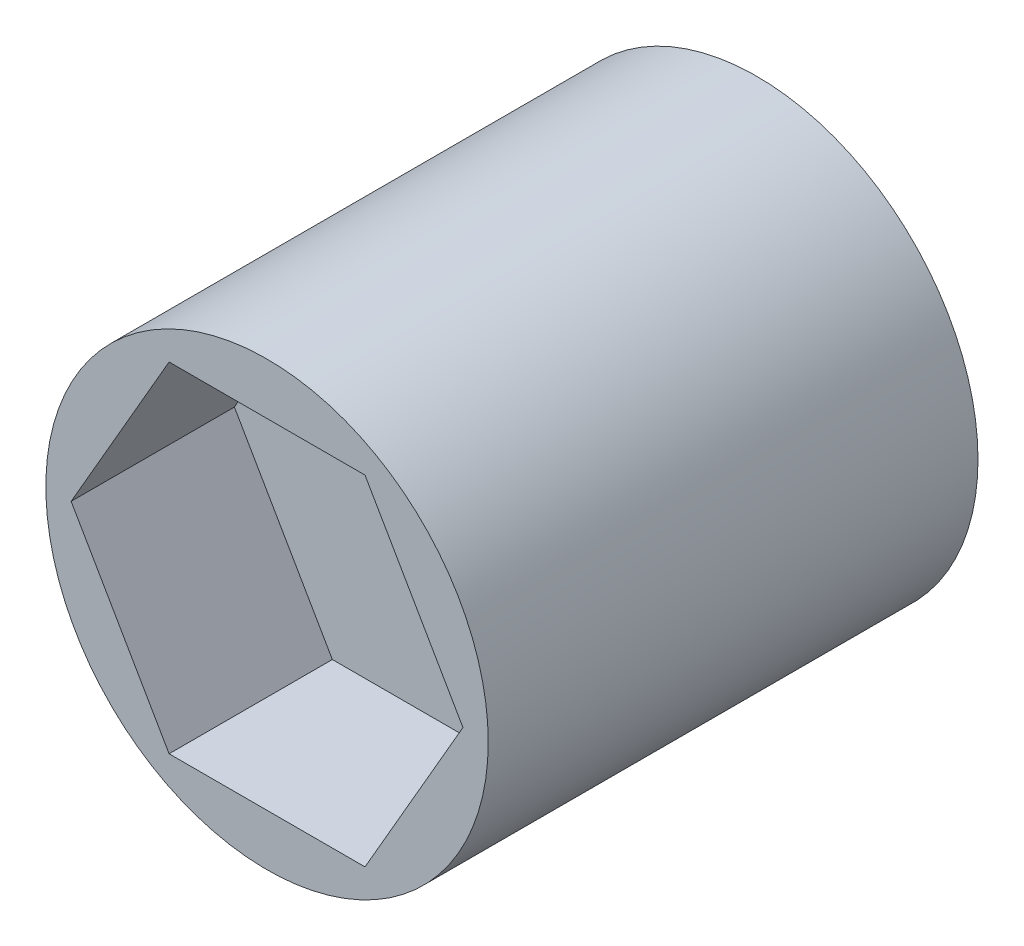
ISO-10303-21;
HEADER;
FILE_DESCRIPTION(('STEP AP214'),'2;1');
FILE_NAME('part.step','',(''),(''),'','','');
FILE_SCHEMA(('AUTOMOTIVE_DESIGN { 1 0 10303 214 1 1 1 1 }'));
ENDSEC;
DATA;
#1=APPLICATION_CONTEXT('core data for automotive mechanical design processes');
#2=APPLICATION_PROTOCOL_DEFINITION('international standard','automotive_design',2000,#1);
#3=PRODUCT_CONTEXT('',#1,'mechanical');
#4=PRODUCT('Part','Part','',(#3));
#5=PRODUCT_RELATED_PRODUCT_CATEGORY('part','',(#4));
#6=PRODUCT_DEFINITION_FORMATION('','',#4);
#7=PRODUCT_DEFINITION_CONTEXT('part definition',#1,'design');
#8=PRODUCT_DEFINITION('design','',#6,#7);
#9=PRODUCT_DEFINITION_SHAPE('','',#8);
#10=(LENGTH_UNIT() NAMED_UNIT(*) SI_UNIT(.MILLI.,.METRE.));
#11=(NAMED_UNIT(*) PLANE_ANGLE_UNIT() SI_UNIT($,.RADIAN.));
#12=(NAMED_UNIT(*) SI_UNIT($,.STERADIAN.) SOLID_ANGLE_UNIT());
#13=UNCERTAINTY_MEASURE_WITH_UNIT(LENGTH_MEASURE(1.E-05),#10,'distance_accuracy_value','');
#14=(GEOMETRIC_REPRESENTATION_CONTEXT(3) GLOBAL_UNCERTAINTY_ASSIGNED_CONTEXT((#13)) GLOBAL_UNIT_ASSIGNED_CONTEXT((#10,
#11,#12)) REPRESENTATION_CONTEXT('',''));
#15=CARTESIAN_POINT('',(0.,0.,0.));
#16=DIRECTION('',(0.,0.,1.));
#17=DIRECTION('',(1.,0.,0.));
#18=AXIS2_PLACEMENT_3D('',#15,#16,#17);
#19=CARTESIAN_POINT('',(0.,0.,15.));
#20=DIRECTION('',(0.,0.,-1.));
#21=DIRECTION('',(-1.,0.,0.));
#22=AXIS2_PLACEMENT_3D('',#19,#20,#21);
#23=CYLINDRICAL_SURFACE('',#22,6.775);
#24=CARTESIAN_POINT('',(0.,0.,15.));
#25=DIRECTION('',(0.,0.,1.));
#26=DIRECTION('',(1.,0.,0.));
#27=AXIS2_PLACEMENT_3D('',#24,#25,#26);
#28=CIRCLE('',#27,6.775);
#29=CARTESIAN_POINT('',(6.775,0.,15.));
#30=VERTEX_POINT('',#29);
#31=EDGE_CURVE('E11',#30,#30,#28,.T.);
#32=ORIENTED_EDGE('',*,*,#31,.F.);
#33=EDGE_LOOP('',(#32));
#34=FACE_BOUND('',#33,.T.);
#35=CARTESIAN_POINT('',(0.,0.,0.));
#36=DIRECTION('',(0.,0.,1.));
#37=DIRECTION('',(1.,0.,0.));
#38=AXIS2_PLACEMENT_3D('',#35,#36,#37);
#39=CIRCLE('',#38,6.775);
#40=CARTESIAN_POINT('',(6.775,0.,0.));
#41=VERTEX_POINT('',#40);
#42=EDGE_CURVE('E40',#41,#41,#39,.T.);
#43=ORIENTED_EDGE('',*,*,#42,.T.);
#44=EDGE_LOOP('',(#43));
#45=FACE_BOUND('',#44,.T.);
#46=ADVANCED_FACE('F37',(#34,#45),#23,.T.);
#47=CARTESIAN_POINT('',(0.,0.,15.));
#48=DIRECTION('',(0.,0.,1.));
#49=DIRECTION('',(1.,0.,0.));
#50=AXIS2_PLACEMENT_3D('',#47,#48,#49);
#51=PLANE('',#50);
#52=DIRECTION('',(0.5,-0.866025403784439,0.));
#53=VECTOR('',#52,1.);
#54=CARTESIAN_POINT('',(-6.,0.,15.));
#55=LINE('',#54,#53);
#56=CARTESIAN_POINT('',(-6.,0.,15.));
#57=VERTEX_POINT('',#56);
#58=CARTESIAN_POINT('',(-3.,-5.19615242270663,15.));
#59=VERTEX_POINT('',#58);
#60=EDGE_CURVE('E51',#57,#59,#55,.T.);
#61=ORIENTED_EDGE('',*,*,#60,.F.);
#62=DIRECTION('',(-0.499999999999999,-0.866025403784439,0.));
#63=VECTOR('',#62,1.);
#64=CARTESIAN_POINT('',(-3.,5.19615242270663,15.));
#65=LINE('',#64,#63);
#66=CARTESIAN_POINT('',(-3.,5.19615242270663,15.));
#67=VERTEX_POINT('',#66);
#68=EDGE_CURVE('E134',#67,#57,#65,.T.);
#69=ORIENTED_EDGE('',*,*,#68,.F.);
#70=DIRECTION('',(-1.,0.,0.));
#71=VECTOR('',#70,1.);
#72=CARTESIAN_POINT('',(3.,5.19615242270663,15.));
#73=LINE('',#72,#71);
#74=CARTESIAN_POINT('',(3.,5.19615242270663,15.));
#75=VERTEX_POINT('',#74);
#76=EDGE_CURVE('E132',#75,#67,#73,.T.);
#77=ORIENTED_EDGE('',*,*,#76,.F.);
#78=DIRECTION('',(-0.5,0.866025403784439,0.));
#79=VECTOR('',#78,1.);
#80=CARTESIAN_POINT('',(6.,0.,15.));
#81=LINE('',#80,#79);
#82=CARTESIAN_POINT('',(6.,0.,15.));
#83=VERTEX_POINT('',#82);
#84=EDGE_CURVE('E99',#83,#75,#81,.T.);
#85=ORIENTED_EDGE('',*,*,#84,.F.);
#86=DIRECTION('',(0.499999999999999,0.866025403784439,0.));
#87=VECTOR('',#86,1.);
#88=CARTESIAN_POINT('',(3.,-5.19615242270663,15.));
#89=LINE('',#88,#87);
#90=CARTESIAN_POINT('',(3.,-5.19615242270663,15.));
#91=VERTEX_POINT('',#90);
#92=EDGE_CURVE('E128',#91,#83,#89,.T.);
#93=ORIENTED_EDGE('',*,*,#92,.F.);
#94=DIRECTION('',(1.,0.,0.));
#95=VECTOR('',#94,1.);
#96=CARTESIAN_POINT('',(-3.,-5.19615242270663,15.));
#97=LINE('',#96,#95);
#98=EDGE_CURVE('E125',#59,#91,#97,.T.);
#99=ORIENTED_EDGE('',*,*,#98,.F.);
#100=EDGE_LOOP('',(#61,#69,#77,#85,#93,#99));
#101=FACE_BOUND('',#100,.T.);
#102=ORIENTED_EDGE('',*,*,#31,.T.);
#103=EDGE_LOOP('',(#102));
#104=FACE_BOUND('',#103,.T.);
#105=ADVANCED_FACE('F147',(#101,#104),#51,.T.);
#106=CARTESIAN_POINT('',(0.,0.,0.));
#107=DIRECTION('',(0.,0.,1.));
#108=DIRECTION('',(1.,0.,0.));
#109=AXIS2_PLACEMENT_3D('',#106,#107,#108);
#110=PLANE('',#109);
#111=ORIENTED_EDGE('',*,*,#42,.F.);
#112=EDGE_LOOP('',(#111));
#113=FACE_BOUND('',#112,.T.);
#114=ADVANCED_FACE('F156',(#113),#110,.F.);
#115=CARTESIAN_POINT('',(-6.,0.,10.));
#116=DIRECTION('',(-0.866025403784439,-0.5,0.));
#117=DIRECTION('',(0.5,-0.866025403784439,0.));
#118=AXIS2_PLACEMENT_3D('',#115,#116,#117);
#119=PLANE('',#118);
#120=ORIENTED_EDGE('',*,*,#60,.T.);
#121=DIRECTION('',(0.,0.,1.));
#122=VECTOR('',#121,1.);
#123=CARTESIAN_POINT('',(-3.,-5.19615242270663,10.));
#124=LINE('',#123,#122);
#125=CARTESIAN_POINT('',(-3.,-5.19615242270663,10.));
#126=VERTEX_POINT('',#125);
#127=EDGE_CURVE('E81',#126,#59,#124,.T.);
#128=ORIENTED_EDGE('',*,*,#127,.F.);
#129=DIRECTION('',(0.5,-0.866025403784439,0.));
#130=VECTOR('',#129,1.);
#131=CARTESIAN_POINT('',(-6.,0.,10.));
#132=LINE('',#131,#130);
#133=CARTESIAN_POINT('',(-6.,0.,10.));
#134=VERTEX_POINT('',#133);
#135=EDGE_CURVE('E136',#134,#126,#132,.T.);
#136=ORIENTED_EDGE('',*,*,#135,.F.);
#137=DIRECTION('',(0.,0.,1.));
#138=VECTOR('',#137,1.);
#139=CARTESIAN_POINT('',(-6.,0.,10.));
#140=LINE('',#139,#138);
#141=EDGE_CURVE('E59',#134,#57,#140,.T.);
#142=ORIENTED_EDGE('',*,*,#141,.T.);
#143=EDGE_LOOP('',(#120,#128,#136,#142));
#144=FACE_BOUND('',#143,.T.);
#145=ADVANCED_FACE('F153',(#144),#119,.F.);
#146=CARTESIAN_POINT('',(-3.,5.19615242270663,10.));
#147=DIRECTION('',(-0.866025403784439,0.5,0.));
#148=DIRECTION('',(-0.5,-0.866025403784439,0.));
#149=AXIS2_PLACEMENT_3D('',#146,#147,#148);
#150=PLANE('',#149);
#151=ORIENTED_EDGE('',*,*,#68,.T.);
#152=ORIENTED_EDGE('',*,*,#141,.F.);
#153=DIRECTION('',(-0.499999999999999,-0.866025403784439,0.));
#154=VECTOR('',#153,1.);
#155=CARTESIAN_POINT('',(-3.,5.19615242270663,10.));
#156=LINE('',#155,#154);
#157=CARTESIAN_POINT('',(-3.,5.19615242270663,10.));
#158=VERTEX_POINT('',#157);
#159=EDGE_CURVE('E111',#158,#134,#156,.T.);
#160=ORIENTED_EDGE('',*,*,#159,.F.);
#161=DIRECTION('',(0.,0.,1.));
#162=VECTOR('',#161,1.);
#163=CARTESIAN_POINT('',(-3.,5.19615242270663,10.));
#164=LINE('',#163,#162);
#165=EDGE_CURVE('E103',#158,#67,#164,.T.);
#166=ORIENTED_EDGE('',*,*,#165,.T.);
#167=EDGE_LOOP('',(#151,#152,#160,#166));
#168=FACE_BOUND('',#167,.T.);
#169=ADVANCED_FACE('F155',(#168),#150,.F.);
#170=CARTESIAN_POINT('',(3.,5.19615242270663,10.));
#171=DIRECTION('',(0.,1.,0.));
#172=DIRECTION('',(-1.,0.,0.));
#173=AXIS2_PLACEMENT_3D('',#170,#171,#172);
#174=PLANE('',#173);
#175=ORIENTED_EDGE('',*,*,#76,.T.);
#176=ORIENTED_EDGE('',*,*,#165,.F.);
#177=DIRECTION('',(-1.,0.,0.));
#178=VECTOR('',#177,1.);
#179=CARTESIAN_POINT('',(3.,5.19615242270663,10.));
#180=LINE('',#179,#178);
#181=CARTESIAN_POINT('',(3.,5.19615242270663,10.));
#182=VERTEX_POINT('',#181);
#183=EDGE_CURVE('E107',#182,#158,#180,.T.);
#184=ORIENTED_EDGE('',*,*,#183,.F.);
#185=DIRECTION('',(0.,0.,1.));
#186=VECTOR('',#185,1.);
#187=CARTESIAN_POINT('',(3.,5.19615242270663,10.));
#188=LINE('',#187,#186);
#189=EDGE_CURVE('E92',#182,#75,#188,.T.);
#190=ORIENTED_EDGE('',*,*,#189,.T.);
#191=EDGE_LOOP('',(#175,#176,#184,#190));
#192=FACE_BOUND('',#191,.T.);
#193=ADVANCED_FACE('F108',(#192),#174,.F.);
#194=CARTESIAN_POINT('',(6.,0.,10.));
#195=DIRECTION('',(0.866025403784438,0.5,0.));
#196=DIRECTION('',(-0.5,0.866025403784439,0.));
#197=AXIS2_PLACEMENT_3D('',#194,#195,#196);
#198=PLANE('',#197);
#199=ORIENTED_EDGE('',*,*,#84,.T.);
#200=ORIENTED_EDGE('',*,*,#189,.F.);
#201=DIRECTION('',(-0.5,0.866025403784439,0.));
#202=VECTOR('',#201,1.);
#203=CARTESIAN_POINT('',(6.,0.,10.));
#204=LINE('',#203,#202);
#205=CARTESIAN_POINT('',(6.,0.,10.));
#206=VERTEX_POINT('',#205);
#207=EDGE_CURVE('E96',#206,#182,#204,.T.);
#208=ORIENTED_EDGE('',*,*,#207,.F.);
#209=DIRECTION('',(0.,0.,1.));
#210=VECTOR('',#209,1.);
#211=CARTESIAN_POINT('',(6.,0.,10.));
#212=LINE('',#211,#210);
#213=EDGE_CURVE('E104',#206,#83,#212,.T.);
#214=ORIENTED_EDGE('',*,*,#213,.T.);
#215=EDGE_LOOP('',(#199,#200,#208,#214));
#216=FACE_BOUND('',#215,.T.);
#217=ADVANCED_FACE('F94',(#216),#198,.F.);
#218=CARTESIAN_POINT('',(3.,-5.19615242270663,10.));
#219=DIRECTION('',(0.866025403784439,-0.5,0.));
#220=DIRECTION('',(0.5,0.866025403784439,0.));
#221=AXIS2_PLACEMENT_3D('',#218,#219,#220);
#222=PLANE('',#221);
#223=ORIENTED_EDGE('',*,*,#92,.T.);
#224=ORIENTED_EDGE('',*,*,#213,.F.);
#225=DIRECTION('',(0.499999999999999,0.866025403784439,0.));
#226=VECTOR('',#225,1.);
#227=CARTESIAN_POINT('',(3.,-5.19615242270663,10.));
#228=LINE('',#227,#226);
#229=CARTESIAN_POINT('',(3.,-5.19615242270663,10.));
#230=VERTEX_POINT('',#229);
#231=EDGE_CURVE('E117',#230,#206,#228,.T.);
#232=ORIENTED_EDGE('',*,*,#231,.F.);
#233=DIRECTION('',(0.,0.,1.));
#234=VECTOR('',#233,1.);
#235=CARTESIAN_POINT('',(3.,-5.19615242270663,10.));
#236=LINE('',#235,#234);
#237=EDGE_CURVE('E140',#230,#91,#236,.T.);
#238=ORIENTED_EDGE('',*,*,#237,.T.);
#239=EDGE_LOOP('',(#223,#224,#232,#238));
#240=FACE_BOUND('',#239,.T.);
#241=ADVANCED_FACE('F151',(#240),#222,.F.);
#242=CARTESIAN_POINT('',(-3.,-5.19615242270663,10.));
#243=DIRECTION('',(0.,-1.,0.));
#244=DIRECTION('',(0.,0.,-1.));
#245=AXIS2_PLACEMENT_3D('',#242,#243,#244);
#246=PLANE('',#245);
#247=ORIENTED_EDGE('',*,*,#98,.T.);
#248=ORIENTED_EDGE('',*,*,#237,.F.);
#249=DIRECTION('',(1.,0.,0.));
#250=VECTOR('',#249,1.);
#251=CARTESIAN_POINT('',(-3.,-5.19615242270663,10.));
#252=LINE('',#251,#250);
#253=EDGE_CURVE('E119',#126,#230,#252,.T.);
#254=ORIENTED_EDGE('',*,*,#253,.F.);
#255=ORIENTED_EDGE('',*,*,#127,.T.);
#256=EDGE_LOOP('',(#247,#248,#254,#255));
#257=FACE_BOUND('',#256,.T.);
#258=ADVANCED_FACE('F144',(#257),#246,.F.);
#259=CARTESIAN_POINT('',(0.,0.,10.));
#260=DIRECTION('',(0.,0.,1.));
#261=DIRECTION('',(1.,0.,0.));
#262=AXIS2_PLACEMENT_3D('',#259,#260,#261);
#263=PLANE('',#262);
#264=ORIENTED_EDGE('',*,*,#135,.T.);
#265=ORIENTED_EDGE('',*,*,#253,.T.);
#266=ORIENTED_EDGE('',*,*,#231,.T.);
#267=ORIENTED_EDGE('',*,*,#207,.T.);
#268=ORIENTED_EDGE('',*,*,#183,.T.);
#269=ORIENTED_EDGE('',*,*,#159,.T.);
#270=EDGE_LOOP('',(#264,#265,#266,#267,#268,#269));
#271=FACE_BOUND('',#270,.T.);
#272=ADVANCED_FACE('F114',(#271),#263,.T.);
#273=CLOSED_SHELL('',(#46,#105,#114,#145,#169,#193,#217,#241,#258,#272));
#274=MANIFOLD_SOLID_BREP('B2',#273);
#275=ADVANCED_BREP_SHAPE_REPRESENTATION('',(#18,#274),#14);
#276=SHAPE_DEFINITION_REPRESENTATION(#9,#275);
ENDSEC;
END-ISO-10303-21;
